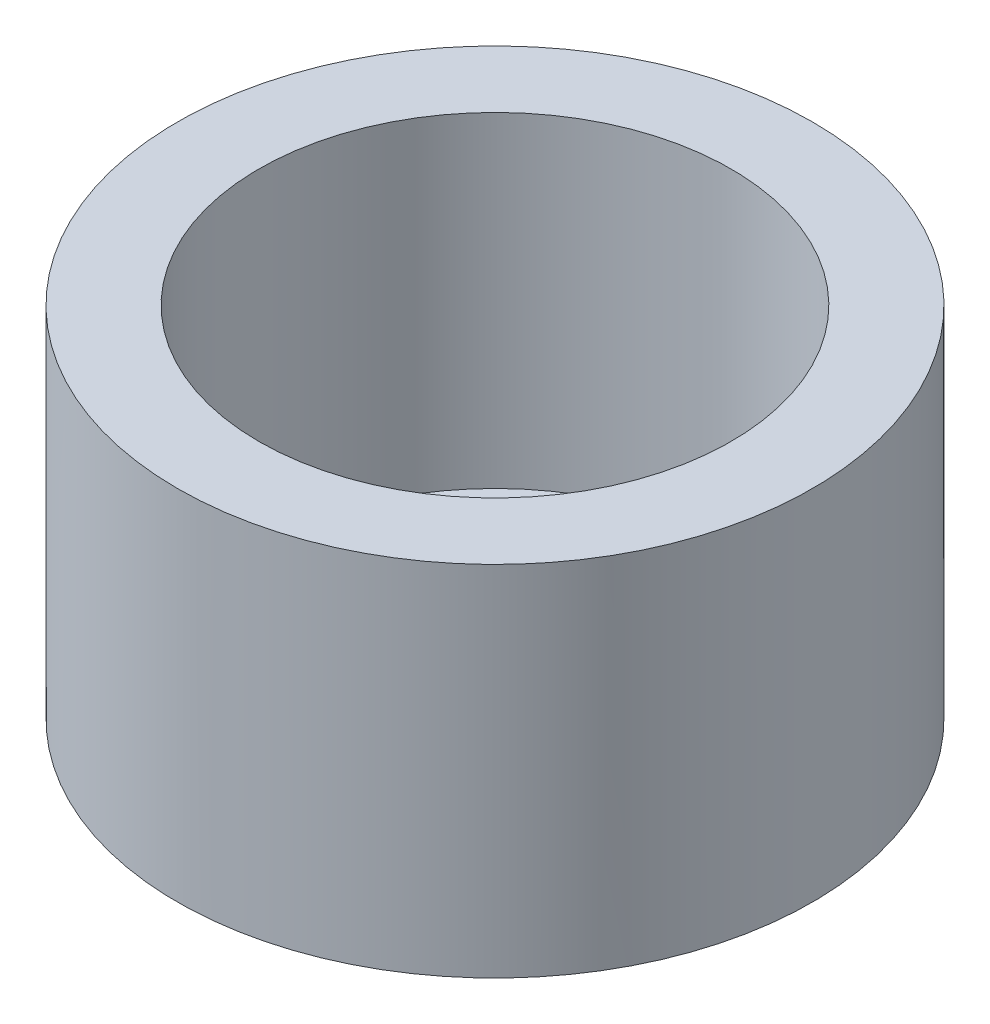
ISO-10303-21;
HEADER;
FILE_DESCRIPTION(('STEP AP214'),'2;1');
FILE_NAME('part.step','',(''),(''),'','','');
FILE_SCHEMA(('AUTOMOTIVE_DESIGN { 1 0 10303 214 1 1 1 1 }'));
ENDSEC;
DATA;
#1=APPLICATION_CONTEXT('core data for automotive mechanical design processes');
#2=APPLICATION_PROTOCOL_DEFINITION('international standard','automotive_design',2000,#1);
#3=PRODUCT_CONTEXT('',#1,'mechanical');
#4=PRODUCT('Part','Part','',(#3));
#5=PRODUCT_RELATED_PRODUCT_CATEGORY('part','',(#4));
#6=PRODUCT_DEFINITION_FORMATION('','',#4);
#7=PRODUCT_DEFINITION_CONTEXT('part definition',#1,'design');
#8=PRODUCT_DEFINITION('design','',#6,#7);
#9=PRODUCT_DEFINITION_SHAPE('','',#8);
#10=(LENGTH_UNIT() NAMED_UNIT(*) SI_UNIT(.MILLI.,.METRE.));
#11=(NAMED_UNIT(*) PLANE_ANGLE_UNIT() SI_UNIT($,.RADIAN.));
#12=(NAMED_UNIT(*) SI_UNIT($,.STERADIAN.) SOLID_ANGLE_UNIT());
#13=UNCERTAINTY_MEASURE_WITH_UNIT(LENGTH_MEASURE(1.E-05),#10,'distance_accuracy_value','');
#14=(GEOMETRIC_REPRESENTATION_CONTEXT(3) GLOBAL_UNCERTAINTY_ASSIGNED_CONTEXT((#13)) GLOBAL_UNIT_ASSIGNED_CONTEXT((#10,
#11,#12)) REPRESENTATION_CONTEXT('',''));
#15=CARTESIAN_POINT('',(0.,0.,0.));
#16=DIRECTION('',(0.,0.,1.));
#17=DIRECTION('',(1.,0.,0.));
#18=AXIS2_PLACEMENT_3D('',#15,#16,#17);
#19=CARTESIAN_POINT('',(0.,20.,0.));
#20=DIRECTION('',(0.,1.,0.));
#21=DIRECTION('',(0.,0.,1.));
#22=AXIS2_PLACEMENT_3D('',#19,#20,#21);
#23=PLANE('',#22);
#24=CARTESIAN_POINT('',(0.,20.,0.));
#25=DIRECTION('',(0.,1.,0.));
#26=DIRECTION('',(0.,0.,1.));
#27=AXIS2_PLACEMENT_3D('',#24,#25,#26);
#28=CIRCLE('',#27,19.5);
#29=CARTESIAN_POINT('',(0.,20.,19.5));
#30=VERTEX_POINT('',#29);
#31=EDGE_CURVE('E10',#30,#30,#28,.T.);
#32=ORIENTED_EDGE('',*,*,#31,.T.);
#33=EDGE_LOOP('',(#32));
#34=FACE_BOUND('',#33,.T.);
#35=CARTESIAN_POINT('',(0.,20.,0.));
#36=DIRECTION('',(0.,1.,0.));
#37=DIRECTION('',(0.,0.,1.));
#38=AXIS2_PLACEMENT_3D('',#35,#36,#37);
#39=CIRCLE('',#38,14.5);
#40=CARTESIAN_POINT('',(0.,20.,14.5));
#41=VERTEX_POINT('',#40);
#42=EDGE_CURVE('E51',#41,#41,#39,.T.);
#43=ORIENTED_EDGE('',*,*,#42,.F.);
#44=EDGE_LOOP('',(#43));
#45=FACE_BOUND('',#44,.T.);
#46=ADVANCED_FACE('F43',(#34,#45),#23,.T.);
#47=CARTESIAN_POINT('',(0.,20.,0.));
#48=DIRECTION('',(0.,-1.,0.));
#49=DIRECTION('',(0.,0.,-1.));
#50=AXIS2_PLACEMENT_3D('',#47,#48,#49);
#51=CYLINDRICAL_SURFACE('',#50,19.5);
#52=ORIENTED_EDGE('',*,*,#31,.F.);
#53=EDGE_LOOP('',(#52));
#54=FACE_BOUND('',#53,.T.);
#55=CARTESIAN_POINT('',(0.,-2.,0.));
#56=DIRECTION('',(0.,-1.,0.));
#57=DIRECTION('',(0.,0.,-1.));
#58=AXIS2_PLACEMENT_3D('',#55,#56,#57);
#59=CIRCLE('',#58,19.5);
#60=CARTESIAN_POINT('',(0.,-2.,-19.5));
#61=VERTEX_POINT('',#60);
#62=EDGE_CURVE('E62',#61,#61,#59,.T.);
#63=ORIENTED_EDGE('',*,*,#62,.F.);
#64=EDGE_LOOP('',(#63));
#65=FACE_BOUND('',#64,.T.);
#66=ADVANCED_FACE('F45',(#54,#65),#51,.T.);
#67=CARTESIAN_POINT('',(0.,20.,0.));
#68=DIRECTION('',(0.,-1.,0.));
#69=DIRECTION('',(0.,0.,-1.));
#70=AXIS2_PLACEMENT_3D('',#67,#68,#69);
#71=CYLINDRICAL_SURFACE('',#70,14.5);
#72=ORIENTED_EDGE('',*,*,#42,.T.);
#73=EDGE_LOOP('',(#72));
#74=FACE_BOUND('',#73,.T.);
#75=CARTESIAN_POINT('',(0.,0.,0.));
#76=DIRECTION('',(0.,1.,0.));
#77=DIRECTION('',(0.,0.,1.));
#78=AXIS2_PLACEMENT_3D('',#75,#76,#77);
#79=CIRCLE('',#78,14.5);
#80=CARTESIAN_POINT('',(0.,0.,14.5));
#81=VERTEX_POINT('',#80);
#82=EDGE_CURVE('E56',#81,#81,#79,.T.);
#83=ORIENTED_EDGE('',*,*,#82,.F.);
#84=EDGE_LOOP('',(#83));
#85=FACE_BOUND('',#84,.T.);
#86=ADVANCED_FACE('F92',(#74,#85),#71,.F.);
#87=CARTESIAN_POINT('',(0.,0.,0.));
#88=DIRECTION('',(0.,-1.,0.));
#89=DIRECTION('',(0.,0.,-1.));
#90=AXIS2_PLACEMENT_3D('',#87,#88,#89);
#91=PLANE('',#90);
#92=ORIENTED_EDGE('',*,*,#82,.T.);
#93=EDGE_LOOP('',(#92));
#94=FACE_BOUND('',#93,.T.);
#95=ADVANCED_FACE('F87',(#94),#91,.F.);
#96=CARTESIAN_POINT('',(0.,-2.,0.));
#97=DIRECTION('',(0.,-1.,0.));
#98=DIRECTION('',(0.,0.,-1.));
#99=AXIS2_PLACEMENT_3D('',#96,#97,#98);
#100=PLANE('',#99);
#101=CARTESIAN_POINT('',(0.,-2.,0.));
#102=DIRECTION('',(0.,-1.,0.));
#103=DIRECTION('',(0.,0.,-1.));
#104=AXIS2_PLACEMENT_3D('',#101,#102,#103);
#105=CIRCLE('',#104,2.85);
#106=CARTESIAN_POINT('',(0.,-2.,-2.85));
#107=VERTEX_POINT('',#106);
#108=EDGE_CURVE('E68',#107,#107,#105,.T.);
#109=ORIENTED_EDGE('',*,*,#108,.F.);
#110=EDGE_LOOP('',(#109));
#111=FACE_BOUND('',#110,.T.);
#112=ORIENTED_EDGE('',*,*,#62,.T.);
#113=EDGE_LOOP('',(#112));
#114=FACE_BOUND('',#113,.T.);
#115=ADVANCED_FACE('F81',(#111,#114),#100,.T.);
#116=CARTESIAN_POINT('',(0.,-8.,0.));
#117=DIRECTION('',(0.,1.,0.));
#118=DIRECTION('',(0.,0.,1.));
#119=AXIS2_PLACEMENT_3D('',#116,#117,#118);
#120=CYLINDRICAL_SURFACE('',#119,2.85);
#121=CARTESIAN_POINT('',(0.,-8.,0.));
#122=DIRECTION('',(0.,-1.,0.));
#123=DIRECTION('',(0.,0.,-1.));
#124=AXIS2_PLACEMENT_3D('',#121,#122,#123);
#125=CIRCLE('',#124,2.85);
#126=CARTESIAN_POINT('',(0.,-8.,-2.85));
#127=VERTEX_POINT('',#126);
#128=EDGE_CURVE('E67',#127,#127,#125,.T.);
#129=ORIENTED_EDGE('',*,*,#128,.F.);
#130=EDGE_LOOP('',(#129));
#131=FACE_BOUND('',#130,.T.);
#132=ORIENTED_EDGE('',*,*,#108,.T.);
#133=EDGE_LOOP('',(#132));
#134=FACE_BOUND('',#133,.T.);
#135=ADVANCED_FACE('F78',(#131,#134),#120,.T.);
#136=CARTESIAN_POINT('',(0.,-8.,0.));
#137=DIRECTION('',(0.,-1.,0.));
#138=DIRECTION('',(0.,0.,-1.));
#139=AXIS2_PLACEMENT_3D('',#136,#137,#138);
#140=PLANE('',#139);
#141=ORIENTED_EDGE('',*,*,#128,.T.);
#142=EDGE_LOOP('',(#141));
#143=FACE_BOUND('',#142,.T.);
#144=ADVANCED_FACE('F76',(#143),#140,.T.);
#145=CLOSED_SHELL('',(#46,#66,#86,#95,#115,#135,#144));
#146=MANIFOLD_SOLID_BREP('B2',#145);
#147=ADVANCED_BREP_SHAPE_REPRESENTATION('',(#18,#146),#14);
#148=SHAPE_DEFINITION_REPRESENTATION(#9,#147);
ENDSEC;
END-ISO-10303-21;
